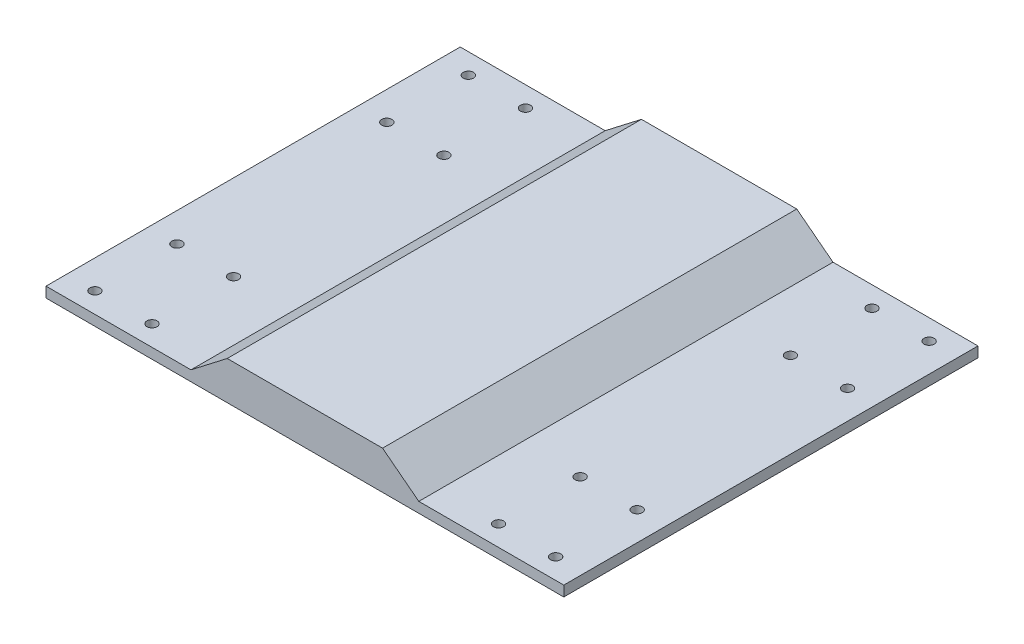
ISO-10303-21;
HEADER;
FILE_DESCRIPTION(('STEP AP214'),'2;1');
FILE_NAME('part.step','',(''),(''),'','','');
FILE_SCHEMA(('AUTOMOTIVE_DESIGN { 1 0 10303 214 1 1 1 1 }'));
ENDSEC;
DATA;
#1=APPLICATION_CONTEXT('core data for automotive mechanical design processes');
#2=APPLICATION_PROTOCOL_DEFINITION('international standard','automotive_design',2000,#1);
#3=PRODUCT_CONTEXT('',#1,'mechanical');
#4=PRODUCT('Part','Part','',(#3));
#5=PRODUCT_RELATED_PRODUCT_CATEGORY('part','',(#4));
#6=PRODUCT_DEFINITION_FORMATION('','',#4);
#7=PRODUCT_DEFINITION_CONTEXT('part definition',#1,'design');
#8=PRODUCT_DEFINITION('design','',#6,#7);
#9=PRODUCT_DEFINITION_SHAPE('','',#8);
#10=(LENGTH_UNIT() NAMED_UNIT(*) SI_UNIT(.MILLI.,.METRE.));
#11=(NAMED_UNIT(*) PLANE_ANGLE_UNIT() SI_UNIT($,.RADIAN.));
#12=(NAMED_UNIT(*) SI_UNIT($,.STERADIAN.) SOLID_ANGLE_UNIT());
#13=UNCERTAINTY_MEASURE_WITH_UNIT(LENGTH_MEASURE(1.E-05),#10,'distance_accuracy_value','');
#14=(GEOMETRIC_REPRESENTATION_CONTEXT(3) GLOBAL_UNCERTAINTY_ASSIGNED_CONTEXT((#13)) GLOBAL_UNIT_ASSIGNED_CONTEXT((#10,
#11,#12)) REPRESENTATION_CONTEXT('',''));
#15=CARTESIAN_POINT('',(0.,0.,0.));
#16=DIRECTION('',(0.,0.,1.));
#17=DIRECTION('',(1.,0.,0.));
#18=AXIS2_PLACEMENT_3D('',#15,#16,#17);
#19=CARTESIAN_POINT('',(0.,2.54,0.));
#20=DIRECTION('',(0.,1.,0.));
#21=DIRECTION('',(0.,0.,1.));
#22=AXIS2_PLACEMENT_3D('',#19,#20,#21);
#23=PLANE('',#22);
#24=CARTESIAN_POINT('',(21.,2.54,96.6));
#25=DIRECTION('',(0.,-1.,0.));
#26=DIRECTION('',(0.,0.,-1.));
#27=AXIS2_PLACEMENT_3D('',#24,#25,#26);
#28=CIRCLE('',#27,1.25);
#29=CARTESIAN_POINT('',(21.,2.54,95.35));
#30=VERTEX_POINT('',#29);
#31=EDGE_CURVE('E431',#30,#30,#28,.T.);
#32=ORIENTED_EDGE('',*,*,#31,.T.);
#33=EDGE_LOOP('',(#32));
#34=FACE_BOUND('',#33,.T.);
#35=CARTESIAN_POINT('',(21.,2.54,76.6));
#36=DIRECTION('',(0.,-1.,0.));
#37=DIRECTION('',(0.,0.,-1.));
#38=AXIS2_PLACEMENT_3D('',#35,#36,#37);
#39=CIRCLE('',#38,1.25);
#40=CARTESIAN_POINT('',(21.,2.54,75.35));
#41=VERTEX_POINT('',#40);
#42=EDGE_CURVE('E425',#41,#41,#39,.T.);
#43=ORIENTED_EDGE('',*,*,#42,.T.);
#44=EDGE_LOOP('',(#43));
#45=FACE_BOUND('',#44,.T.);
#46=CARTESIAN_POINT('',(7.112,2.54,76.6));
#47=DIRECTION('',(0.,-1.,0.));
#48=DIRECTION('',(0.,0.,-1.));
#49=AXIS2_PLACEMENT_3D('',#46,#47,#48);
#50=CIRCLE('',#49,1.25);
#51=CARTESIAN_POINT('',(7.112,2.54,75.35));
#52=VERTEX_POINT('',#51);
#53=EDGE_CURVE('E419',#52,#52,#50,.T.);
#54=ORIENTED_EDGE('',*,*,#53,.T.);
#55=EDGE_LOOP('',(#54));
#56=FACE_BOUND('',#55,.T.);
#57=CARTESIAN_POINT('',(6.99999999999999,2.54,96.6));
#58=DIRECTION('',(0.,-1.,0.));
#59=DIRECTION('',(0.,0.,-1.));
#60=AXIS2_PLACEMENT_3D('',#57,#58,#59);
#61=CIRCLE('',#60,1.25);
#62=CARTESIAN_POINT('',(6.99999999999999,2.54,95.35));
#63=VERTEX_POINT('',#62);
#64=EDGE_CURVE('E413',#63,#63,#61,.T.);
#65=ORIENTED_EDGE('',*,*,#64,.T.);
#66=EDGE_LOOP('',(#65));
#67=FACE_BOUND('',#66,.T.);
#68=CARTESIAN_POINT('',(21.,2.54,25.));
#69=DIRECTION('',(0.,-1.,0.));
#70=DIRECTION('',(0.,0.,-1.));
#71=AXIS2_PLACEMENT_3D('',#68,#69,#70);
#72=CIRCLE('',#71,1.25);
#73=CARTESIAN_POINT('',(21.,2.54,23.75));
#74=VERTEX_POINT('',#73);
#75=EDGE_CURVE('E407',#74,#74,#72,.T.);
#76=ORIENTED_EDGE('',*,*,#75,.T.);
#77=EDGE_LOOP('',(#76));
#78=FACE_BOUND('',#77,.T.);
#79=CARTESIAN_POINT('',(21.,2.54,5.));
#80=DIRECTION('',(0.,-1.,0.));
#81=DIRECTION('',(0.,0.,-1.));
#82=AXIS2_PLACEMENT_3D('',#79,#80,#81);
#83=CIRCLE('',#82,1.25);
#84=CARTESIAN_POINT('',(21.,2.54,3.75000000000001));
#85=VERTEX_POINT('',#84);
#86=EDGE_CURVE('E401',#85,#85,#83,.T.);
#87=ORIENTED_EDGE('',*,*,#86,.T.);
#88=EDGE_LOOP('',(#87));
#89=FACE_BOUND('',#88,.T.);
#90=CARTESIAN_POINT('',(7.,2.54,5.));
#91=DIRECTION('',(0.,-1.,0.));
#92=DIRECTION('',(0.,0.,-1.));
#93=AXIS2_PLACEMENT_3D('',#90,#91,#92);
#94=CIRCLE('',#93,1.25);
#95=CARTESIAN_POINT('',(7.,2.54,3.75));
#96=VERTEX_POINT('',#95);
#97=EDGE_CURVE('E395',#96,#96,#94,.T.);
#98=ORIENTED_EDGE('',*,*,#97,.T.);
#99=EDGE_LOOP('',(#98));
#100=FACE_BOUND('',#99,.T.);
#101=CARTESIAN_POINT('',(7.,2.54,25.));
#102=DIRECTION('',(0.,-1.,0.));
#103=DIRECTION('',(0.,0.,-1.));
#104=AXIS2_PLACEMENT_3D('',#101,#102,#103);
#105=CIRCLE('',#104,1.25);
#106=CARTESIAN_POINT('',(7.,2.54,23.75));
#107=VERTEX_POINT('',#106);
#108=EDGE_CURVE('E387',#107,#107,#105,.T.);
#109=ORIENTED_EDGE('',*,*,#108,.T.);
#110=EDGE_LOOP('',(#109));
#111=FACE_BOUND('',#110,.T.);
#112=DIRECTION('',(1.,0.,0.));
#113=VECTOR('',#112,1.);
#114=CARTESIAN_POINT('',(0.,2.54,101.6));
#115=LINE('',#114,#113);
#116=CARTESIAN_POINT('',(0.,2.54,101.6));
#117=VERTEX_POINT('',#116);
#118=CARTESIAN_POINT('',(35.56,2.54,101.6));
#119=VERTEX_POINT('',#118);
#120=EDGE_CURVE('E110',#117,#119,#115,.T.);
#121=ORIENTED_EDGE('',*,*,#120,.T.);
#122=DIRECTION('',(0.,0.,1.));
#123=VECTOR('',#122,1.);
#124=CARTESIAN_POINT('',(35.56,2.54,0.));
#125=LINE('',#124,#123);
#126=CARTESIAN_POINT('',(35.56,2.54,0.));
#127=VERTEX_POINT('',#126);
#128=EDGE_CURVE('E223',#127,#119,#125,.T.);
#129=ORIENTED_EDGE('',*,*,#128,.F.);
#130=DIRECTION('',(-1.,0.,0.));
#131=VECTOR('',#130,1.);
#132=CARTESIAN_POINT('',(0.,2.54,0.));
#133=LINE('',#132,#131);
#134=CARTESIAN_POINT('',(0.,2.54,0.));
#135=VERTEX_POINT('',#134);
#136=EDGE_CURVE('E81',#127,#135,#133,.T.);
#137=ORIENTED_EDGE('',*,*,#136,.T.);
#138=DIRECTION('',(0.,0.,1.));
#139=VECTOR('',#138,1.);
#140=CARTESIAN_POINT('',(0.,2.54,0.));
#141=LINE('',#140,#139);
#142=EDGE_CURVE('E359',#135,#117,#141,.T.);
#143=ORIENTED_EDGE('',*,*,#142,.T.);
#144=EDGE_LOOP('',(#121,#129,#137,#143));
#145=FACE_BOUND('',#144,.T.);
#146=ADVANCED_FACE('F55',(#34,#45,#56,#67,#78,#89,#100,#111,#145),#23,.T.);
#147=CARTESIAN_POINT('',(106.,2.54,76.6));
#148=DIRECTION('',(0.,-1.,0.));
#149=DIRECTION('',(0.,0.,-1.));
#150=AXIS2_PLACEMENT_3D('',#147,#148,#149);
#151=CIRCLE('',#150,1.25);
#152=CARTESIAN_POINT('',(106.,2.54,75.35));
#153=VERTEX_POINT('',#152);
#154=EDGE_CURVE('E381',#153,#153,#151,.T.);
#155=ORIENTED_EDGE('',*,*,#154,.T.);
#156=EDGE_LOOP('',(#155));
#157=FACE_BOUND('',#156,.T.);
#158=CARTESIAN_POINT('',(106.,2.54,96.6));
#159=DIRECTION('',(0.,-1.,0.));
#160=DIRECTION('',(0.,0.,-1.));
#161=AXIS2_PLACEMENT_3D('',#158,#159,#160);
#162=CIRCLE('',#161,1.25);
#163=CARTESIAN_POINT('',(106.,2.54,95.35));
#164=VERTEX_POINT('',#163);
#165=EDGE_CURVE('E437',#164,#164,#162,.T.);
#166=ORIENTED_EDGE('',*,*,#165,.T.);
#167=EDGE_LOOP('',(#166));
#168=FACE_BOUND('',#167,.T.);
#169=CARTESIAN_POINT('',(120.,2.54,96.6));
#170=DIRECTION('',(0.,-1.,0.));
#171=DIRECTION('',(0.,0.,-1.));
#172=AXIS2_PLACEMENT_3D('',#169,#170,#171);
#173=CIRCLE('',#172,1.25);
#174=CARTESIAN_POINT('',(120.,2.54,95.35));
#175=VERTEX_POINT('',#174);
#176=EDGE_CURVE('E443',#175,#175,#173,.T.);
#177=ORIENTED_EDGE('',*,*,#176,.T.);
#178=EDGE_LOOP('',(#177));
#179=FACE_BOUND('',#178,.T.);
#180=CARTESIAN_POINT('',(120.,2.54,76.6));
#181=DIRECTION('',(0.,-1.,0.));
#182=DIRECTION('',(0.,0.,-1.));
#183=AXIS2_PLACEMENT_3D('',#180,#181,#182);
#184=CIRCLE('',#183,1.25);
#185=CARTESIAN_POINT('',(120.,2.54,75.35));
#186=VERTEX_POINT('',#185);
#187=EDGE_CURVE('E449',#186,#186,#184,.T.);
#188=ORIENTED_EDGE('',*,*,#187,.T.);
#189=EDGE_LOOP('',(#188));
#190=FACE_BOUND('',#189,.T.);
#191=CARTESIAN_POINT('',(106.,2.54,25.));
#192=DIRECTION('',(0.,-1.,0.));
#193=DIRECTION('',(0.,0.,-1.));
#194=AXIS2_PLACEMENT_3D('',#191,#192,#193);
#195=CIRCLE('',#194,1.25);
#196=CARTESIAN_POINT('',(106.,2.54,23.75));
#197=VERTEX_POINT('',#196);
#198=EDGE_CURVE('E455',#197,#197,#195,.T.);
#199=ORIENTED_EDGE('',*,*,#198,.T.);
#200=EDGE_LOOP('',(#199));
#201=FACE_BOUND('',#200,.T.);
#202=CARTESIAN_POINT('',(106.,2.54,5.00000000000005));
#203=DIRECTION('',(0.,-1.,0.));
#204=DIRECTION('',(0.,0.,-1.));
#205=AXIS2_PLACEMENT_3D('',#202,#203,#204);
#206=CIRCLE('',#205,1.25);
#207=CARTESIAN_POINT('',(106.,2.54,3.75000000000004));
#208=VERTEX_POINT('',#207);
#209=EDGE_CURVE('E461',#208,#208,#206,.T.);
#210=ORIENTED_EDGE('',*,*,#209,.T.);
#211=EDGE_LOOP('',(#210));
#212=FACE_BOUND('',#211,.T.);
#213=CARTESIAN_POINT('',(120.,2.54,25.));
#214=DIRECTION('',(0.,-1.,0.));
#215=DIRECTION('',(0.,0.,-1.));
#216=AXIS2_PLACEMENT_3D('',#213,#214,#215);
#217=CIRCLE('',#216,1.25);
#218=CARTESIAN_POINT('',(120.,2.54,23.75));
#219=VERTEX_POINT('',#218);
#220=EDGE_CURVE('E467',#219,#219,#217,.T.);
#221=ORIENTED_EDGE('',*,*,#220,.T.);
#222=EDGE_LOOP('',(#221));
#223=FACE_BOUND('',#222,.T.);
#224=CARTESIAN_POINT('',(120.,2.54,5.00000000000005));
#225=DIRECTION('',(0.,-1.,0.));
#226=DIRECTION('',(0.,0.,-1.));
#227=AXIS2_PLACEMENT_3D('',#224,#225,#226);
#228=CIRCLE('',#227,1.25);
#229=CARTESIAN_POINT('',(120.,2.54,3.75000000000005));
#230=VERTEX_POINT('',#229);
#231=EDGE_CURVE('E472',#230,#230,#228,.T.);
#232=ORIENTED_EDGE('',*,*,#231,.T.);
#233=EDGE_LOOP('',(#232));
#234=FACE_BOUND('',#233,.T.);
#235=CARTESIAN_POINT('',(127.,2.54,0.));
#236=VERTEX_POINT('',#235);
#237=CARTESIAN_POINT('',(91.44,2.54,0.));
#238=VERTEX_POINT('',#237);
#239=EDGE_CURVE('E365',#236,#238,#133,.T.);
#240=ORIENTED_EDGE('',*,*,#239,.T.);
#241=DIRECTION('',(0.,0.,-1.));
#242=VECTOR('',#241,1.);
#243=CARTESIAN_POINT('',(91.44,2.54,0.));
#244=LINE('',#243,#242);
#245=CARTESIAN_POINT('',(91.44,2.54,101.6));
#246=VERTEX_POINT('',#245);
#247=EDGE_CURVE('E138',#246,#238,#244,.T.);
#248=ORIENTED_EDGE('',*,*,#247,.F.);
#249=CARTESIAN_POINT('',(127.,2.54,101.6));
#250=VERTEX_POINT('',#249);
#251=EDGE_CURVE('E369',#246,#250,#115,.T.);
#252=ORIENTED_EDGE('',*,*,#251,.T.);
#253=DIRECTION('',(0.,0.,-1.));
#254=VECTOR('',#253,1.);
#255=CARTESIAN_POINT('',(127.,2.54,0.));
#256=LINE('',#255,#254);
#257=EDGE_CURVE('E355',#250,#236,#256,.T.);
#258=ORIENTED_EDGE('',*,*,#257,.T.);
#259=EDGE_LOOP('',(#240,#248,#252,#258));
#260=FACE_BOUND('',#259,.T.);
#261=ADVANCED_FACE('F304',(#157,#168,#179,#190,#201,#212,#223,#234,#260),#23,.T.);
#262=CARTESIAN_POINT('',(0.,2.54,0.));
#263=DIRECTION('',(1.,0.,0.));
#264=DIRECTION('',(0.,0.,-1.));
#265=AXIS2_PLACEMENT_3D('',#262,#263,#264);
#266=PLANE('',#265);
#267=DIRECTION('',(0.,0.,1.));
#268=VECTOR('',#267,1.);
#269=CARTESIAN_POINT('',(0.,0.,0.));
#270=LINE('',#269,#268);
#271=CARTESIAN_POINT('',(0.,0.,0.));
#272=VERTEX_POINT('',#271);
#273=CARTESIAN_POINT('',(0.,0.,101.6));
#274=VERTEX_POINT('',#273);
#275=EDGE_CURVE('E352',#272,#274,#270,.T.);
#276=ORIENTED_EDGE('',*,*,#275,.T.);
#277=DIRECTION('',(0.,-1.,0.));
#278=VECTOR('',#277,1.);
#279=CARTESIAN_POINT('',(0.,2.54,101.6));
#280=LINE('',#279,#278);
#281=EDGE_CURVE('E12',#117,#274,#280,.T.);
#282=ORIENTED_EDGE('',*,*,#281,.F.);
#283=ORIENTED_EDGE('',*,*,#142,.F.);
#284=DIRECTION('',(0.,-1.,0.));
#285=VECTOR('',#284,1.);
#286=CARTESIAN_POINT('',(0.,2.54,0.));
#287=LINE('',#286,#285);
#288=EDGE_CURVE('E363',#135,#272,#287,.T.);
#289=ORIENTED_EDGE('',*,*,#288,.T.);
#290=EDGE_LOOP('',(#276,#282,#283,#289));
#291=FACE_BOUND('',#290,.T.);
#292=ADVANCED_FACE('F57',(#291),#266,.F.);
#293=CARTESIAN_POINT('',(0.,2.54,101.6));
#294=DIRECTION('',(0.,0.,-1.));
#295=DIRECTION('',(-1.,0.,0.));
#296=AXIS2_PLACEMENT_3D('',#293,#294,#295);
#297=PLANE('',#296);
#298=DIRECTION('',(1.,0.,0.));
#299=VECTOR('',#298,1.);
#300=CARTESIAN_POINT('',(0.,0.,101.6));
#301=LINE('',#300,#299);
#302=CARTESIAN_POINT('',(127.,0.,101.6));
#303=VERTEX_POINT('',#302);
#304=EDGE_CURVE('E342',#274,#303,#301,.T.);
#305=ORIENTED_EDGE('',*,*,#304,.T.);
#306=DIRECTION('',(0.,-1.,0.));
#307=VECTOR('',#306,1.);
#308=CARTESIAN_POINT('',(127.,2.54,101.6));
#309=LINE('',#308,#307);
#310=EDGE_CURVE('E64',#250,#303,#309,.T.);
#311=ORIENTED_EDGE('',*,*,#310,.F.);
#312=ORIENTED_EDGE('',*,*,#251,.F.);
#313=DIRECTION('',(0.791782255563472,-0.610803454291821,0.));
#314=VECTOR('',#313,1.);
#315=CARTESIAN_POINT('',(82.55,9.398,101.6));
#316=LINE('',#315,#314);
#317=CARTESIAN_POINT('',(82.55,9.398,101.6));
#318=VERTEX_POINT('',#317);
#319=EDGE_CURVE('E72',#318,#246,#316,.T.);
#320=ORIENTED_EDGE('',*,*,#319,.F.);
#321=DIRECTION('',(1.,0.,0.));
#322=VECTOR('',#321,1.);
#323=CARTESIAN_POINT('',(82.55,9.398,101.6));
#324=LINE('',#323,#322);
#325=CARTESIAN_POINT('',(44.45,9.398,101.6));
#326=VERTEX_POINT('',#325);
#327=EDGE_CURVE('E157',#326,#318,#324,.T.);
#328=ORIENTED_EDGE('',*,*,#327,.F.);
#329=DIRECTION('',(-0.791782255563471,-0.610803454291822,0.));
#330=VECTOR('',#329,1.);
#331=CARTESIAN_POINT('',(44.45,9.398,101.6));
#332=LINE('',#331,#330);
#333=EDGE_CURVE('E221',#326,#119,#332,.T.);
#334=ORIENTED_EDGE('',*,*,#333,.T.);
#335=ORIENTED_EDGE('',*,*,#120,.F.);
#336=ORIENTED_EDGE('',*,*,#281,.T.);
#337=EDGE_LOOP('',(#305,#311,#312,#320,#328,#334,#335,#336));
#338=FACE_BOUND('',#337,.T.);
#339=ADVANCED_FACE('F326',(#338),#297,.F.);
#340=CARTESIAN_POINT('',(127.,2.54,0.));
#341=DIRECTION('',(-1.,0.,0.));
#342=DIRECTION('',(0.,0.,1.));
#343=AXIS2_PLACEMENT_3D('',#340,#341,#342);
#344=PLANE('',#343);
#345=DIRECTION('',(0.,0.,-1.));
#346=VECTOR('',#345,1.);
#347=CARTESIAN_POINT('',(127.,0.,0.));
#348=LINE('',#347,#346);
#349=CARTESIAN_POINT('',(127.,0.,0.));
#350=VERTEX_POINT('',#349);
#351=EDGE_CURVE('E351',#303,#350,#348,.T.);
#352=ORIENTED_EDGE('',*,*,#351,.T.);
#353=DIRECTION('',(0.,-1.,0.));
#354=VECTOR('',#353,1.);
#355=CARTESIAN_POINT('',(127.,2.54,0.));
#356=LINE('',#355,#354);
#357=EDGE_CURVE('E356',#236,#350,#356,.T.);
#358=ORIENTED_EDGE('',*,*,#357,.F.);
#359=ORIENTED_EDGE('',*,*,#257,.F.);
#360=ORIENTED_EDGE('',*,*,#310,.T.);
#361=EDGE_LOOP('',(#352,#358,#359,#360));
#362=FACE_BOUND('',#361,.T.);
#363=ADVANCED_FACE('F312',(#362),#344,.F.);
#364=CARTESIAN_POINT('',(0.,2.54,0.));
#365=DIRECTION('',(0.,0.,1.));
#366=DIRECTION('',(1.,0.,0.));
#367=AXIS2_PLACEMENT_3D('',#364,#365,#366);
#368=PLANE('',#367);
#369=DIRECTION('',(-1.,0.,0.));
#370=VECTOR('',#369,1.);
#371=CARTESIAN_POINT('',(0.,0.,0.));
#372=LINE('',#371,#370);
#373=EDGE_CURVE('E103',#350,#272,#372,.T.);
#374=ORIENTED_EDGE('',*,*,#373,.T.);
#375=ORIENTED_EDGE('',*,*,#288,.F.);
#376=ORIENTED_EDGE('',*,*,#136,.F.);
#377=DIRECTION('',(-0.791782255563471,-0.610803454291822,0.));
#378=VECTOR('',#377,1.);
#379=CARTESIAN_POINT('',(44.45,9.398,0.));
#380=LINE('',#379,#378);
#381=CARTESIAN_POINT('',(44.45,9.398,0.));
#382=VERTEX_POINT('',#381);
#383=EDGE_CURVE('E141',#382,#127,#380,.T.);
#384=ORIENTED_EDGE('',*,*,#383,.F.);
#385=DIRECTION('',(-1.,0.,0.));
#386=VECTOR('',#385,1.);
#387=CARTESIAN_POINT('',(82.55,9.398,0.));
#388=LINE('',#387,#386);
#389=CARTESIAN_POINT('',(82.55,9.398,0.));
#390=VERTEX_POINT('',#389);
#391=EDGE_CURVE('E142',#390,#382,#388,.T.);
#392=ORIENTED_EDGE('',*,*,#391,.F.);
#393=DIRECTION('',(0.791782255563473,-0.61080345429182,0.));
#394=VECTOR('',#393,1.);
#395=CARTESIAN_POINT('',(82.55,9.398,0.));
#396=LINE('',#395,#394);
#397=EDGE_CURVE('E132',#390,#238,#396,.T.);
#398=ORIENTED_EDGE('',*,*,#397,.T.);
#399=ORIENTED_EDGE('',*,*,#239,.F.);
#400=ORIENTED_EDGE('',*,*,#357,.T.);
#401=EDGE_LOOP('',(#374,#375,#376,#384,#392,#398,#399,#400));
#402=FACE_BOUND('',#401,.T.);
#403=ADVANCED_FACE('F146',(#402),#368,.F.);
#404=CARTESIAN_POINT('',(0.,0.,0.));
#405=DIRECTION('',(0.,1.,0.));
#406=DIRECTION('',(0.,0.,1.));
#407=AXIS2_PLACEMENT_3D('',#404,#405,#406);
#408=PLANE('',#407);
#409=CARTESIAN_POINT('',(120.,0.,5.00000000000005));
#410=DIRECTION('',(0.,-1.,0.));
#411=DIRECTION('',(0.,0.,-1.));
#412=AXIS2_PLACEMENT_3D('',#409,#410,#411);
#413=CIRCLE('',#412,1.25);
#414=CARTESIAN_POINT('',(120.,0.,3.75000000000005));
#415=VERTEX_POINT('',#414);
#416=EDGE_CURVE('E168',#415,#415,#413,.T.);
#417=ORIENTED_EDGE('',*,*,#416,.F.);
#418=EDGE_LOOP('',(#417));
#419=FACE_BOUND('',#418,.T.);
#420=CARTESIAN_POINT('',(120.,0.,25.));
#421=DIRECTION('',(0.,-1.,0.));
#422=DIRECTION('',(0.,0.,-1.));
#423=AXIS2_PLACEMENT_3D('',#420,#421,#422);
#424=CIRCLE('',#423,1.25);
#425=CARTESIAN_POINT('',(120.,0.,23.75));
#426=VERTEX_POINT('',#425);
#427=EDGE_CURVE('E470',#426,#426,#424,.T.);
#428=ORIENTED_EDGE('',*,*,#427,.F.);
#429=EDGE_LOOP('',(#428));
#430=FACE_BOUND('',#429,.T.);
#431=CARTESIAN_POINT('',(106.,0.,5.00000000000005));
#432=DIRECTION('',(0.,-1.,0.));
#433=DIRECTION('',(0.,0.,-1.));
#434=AXIS2_PLACEMENT_3D('',#431,#432,#433);
#435=CIRCLE('',#434,1.25);
#436=CARTESIAN_POINT('',(106.,0.,3.75000000000004));
#437=VERTEX_POINT('',#436);
#438=EDGE_CURVE('E464',#437,#437,#435,.T.);
#439=ORIENTED_EDGE('',*,*,#438,.F.);
#440=EDGE_LOOP('',(#439));
#441=FACE_BOUND('',#440,.T.);
#442=CARTESIAN_POINT('',(106.,0.,25.));
#443=DIRECTION('',(0.,-1.,0.));
#444=DIRECTION('',(0.,0.,-1.));
#445=AXIS2_PLACEMENT_3D('',#442,#443,#444);
#446=CIRCLE('',#445,1.25);
#447=CARTESIAN_POINT('',(106.,0.,23.75));
#448=VERTEX_POINT('',#447);
#449=EDGE_CURVE('E458',#448,#448,#446,.T.);
#450=ORIENTED_EDGE('',*,*,#449,.F.);
#451=EDGE_LOOP('',(#450));
#452=FACE_BOUND('',#451,.T.);
#453=CARTESIAN_POINT('',(120.,0.,76.6));
#454=DIRECTION('',(0.,-1.,0.));
#455=DIRECTION('',(0.,0.,-1.));
#456=AXIS2_PLACEMENT_3D('',#453,#454,#455);
#457=CIRCLE('',#456,1.25);
#458=CARTESIAN_POINT('',(120.,0.,75.35));
#459=VERTEX_POINT('',#458);
#460=EDGE_CURVE('E452',#459,#459,#457,.T.);
#461=ORIENTED_EDGE('',*,*,#460,.F.);
#462=EDGE_LOOP('',(#461));
#463=FACE_BOUND('',#462,.T.);
#464=CARTESIAN_POINT('',(120.,0.,96.6));
#465=DIRECTION('',(0.,-1.,0.));
#466=DIRECTION('',(0.,0.,-1.));
#467=AXIS2_PLACEMENT_3D('',#464,#465,#466);
#468=CIRCLE('',#467,1.25);
#469=CARTESIAN_POINT('',(120.,0.,95.35));
#470=VERTEX_POINT('',#469);
#471=EDGE_CURVE('E446',#470,#470,#468,.T.);
#472=ORIENTED_EDGE('',*,*,#471,.F.);
#473=EDGE_LOOP('',(#472));
#474=FACE_BOUND('',#473,.T.);
#475=CARTESIAN_POINT('',(106.,0.,96.6));
#476=DIRECTION('',(0.,-1.,0.));
#477=DIRECTION('',(0.,0.,-1.));
#478=AXIS2_PLACEMENT_3D('',#475,#476,#477);
#479=CIRCLE('',#478,1.25);
#480=CARTESIAN_POINT('',(106.,0.,95.35));
#481=VERTEX_POINT('',#480);
#482=EDGE_CURVE('E440',#481,#481,#479,.T.);
#483=ORIENTED_EDGE('',*,*,#482,.F.);
#484=EDGE_LOOP('',(#483));
#485=FACE_BOUND('',#484,.T.);
#486=CARTESIAN_POINT('',(21.,0.,96.6));
#487=DIRECTION('',(0.,-1.,0.));
#488=DIRECTION('',(0.,0.,-1.));
#489=AXIS2_PLACEMENT_3D('',#486,#487,#488);
#490=CIRCLE('',#489,1.25);
#491=CARTESIAN_POINT('',(21.,0.,95.35));
#492=VERTEX_POINT('',#491);
#493=EDGE_CURVE('E434',#492,#492,#490,.T.);
#494=ORIENTED_EDGE('',*,*,#493,.F.);
#495=EDGE_LOOP('',(#494));
#496=FACE_BOUND('',#495,.T.);
#497=CARTESIAN_POINT('',(21.,0.,76.6));
#498=DIRECTION('',(0.,-1.,0.));
#499=DIRECTION('',(0.,0.,-1.));
#500=AXIS2_PLACEMENT_3D('',#497,#498,#499);
#501=CIRCLE('',#500,1.25);
#502=CARTESIAN_POINT('',(21.,0.,75.35));
#503=VERTEX_POINT('',#502);
#504=EDGE_CURVE('E428',#503,#503,#501,.T.);
#505=ORIENTED_EDGE('',*,*,#504,.F.);
#506=EDGE_LOOP('',(#505));
#507=FACE_BOUND('',#506,.T.);
#508=CARTESIAN_POINT('',(7.112,0.,76.6));
#509=DIRECTION('',(0.,-1.,0.));
#510=DIRECTION('',(0.,0.,-1.));
#511=AXIS2_PLACEMENT_3D('',#508,#509,#510);
#512=CIRCLE('',#511,1.25);
#513=CARTESIAN_POINT('',(7.112,0.,75.35));
#514=VERTEX_POINT('',#513);
#515=EDGE_CURVE('E422',#514,#514,#512,.T.);
#516=ORIENTED_EDGE('',*,*,#515,.F.);
#517=EDGE_LOOP('',(#516));
#518=FACE_BOUND('',#517,.T.);
#519=CARTESIAN_POINT('',(6.99999999999999,0.,96.6));
#520=DIRECTION('',(0.,-1.,0.));
#521=DIRECTION('',(0.,0.,-1.));
#522=AXIS2_PLACEMENT_3D('',#519,#520,#521);
#523=CIRCLE('',#522,1.25);
#524=CARTESIAN_POINT('',(6.99999999999999,0.,95.35));
#525=VERTEX_POINT('',#524);
#526=EDGE_CURVE('E416',#525,#525,#523,.T.);
#527=ORIENTED_EDGE('',*,*,#526,.F.);
#528=EDGE_LOOP('',(#527));
#529=FACE_BOUND('',#528,.T.);
#530=CARTESIAN_POINT('',(21.,0.,25.));
#531=DIRECTION('',(0.,-1.,0.));
#532=DIRECTION('',(0.,0.,-1.));
#533=AXIS2_PLACEMENT_3D('',#530,#531,#532);
#534=CIRCLE('',#533,1.25);
#535=CARTESIAN_POINT('',(21.,0.,23.75));
#536=VERTEX_POINT('',#535);
#537=EDGE_CURVE('E410',#536,#536,#534,.T.);
#538=ORIENTED_EDGE('',*,*,#537,.F.);
#539=EDGE_LOOP('',(#538));
#540=FACE_BOUND('',#539,.T.);
#541=CARTESIAN_POINT('',(21.,0.,5.));
#542=DIRECTION('',(0.,-1.,0.));
#543=DIRECTION('',(0.,0.,-1.));
#544=AXIS2_PLACEMENT_3D('',#541,#542,#543);
#545=CIRCLE('',#544,1.25);
#546=CARTESIAN_POINT('',(21.,0.,3.75));
#547=VERTEX_POINT('',#546);
#548=EDGE_CURVE('E404',#547,#547,#545,.T.);
#549=ORIENTED_EDGE('',*,*,#548,.F.);
#550=EDGE_LOOP('',(#549));
#551=FACE_BOUND('',#550,.T.);
#552=CARTESIAN_POINT('',(7.,0.,5.));
#553=DIRECTION('',(0.,-1.,0.));
#554=DIRECTION('',(0.,0.,-1.));
#555=AXIS2_PLACEMENT_3D('',#552,#553,#554);
#556=CIRCLE('',#555,1.25);
#557=CARTESIAN_POINT('',(7.,0.,3.75));
#558=VERTEX_POINT('',#557);
#559=EDGE_CURVE('E398',#558,#558,#556,.T.);
#560=ORIENTED_EDGE('',*,*,#559,.F.);
#561=EDGE_LOOP('',(#560));
#562=FACE_BOUND('',#561,.T.);
#563=CARTESIAN_POINT('',(7.,0.,25.));
#564=DIRECTION('',(0.,-1.,0.));
#565=DIRECTION('',(0.,0.,-1.));
#566=AXIS2_PLACEMENT_3D('',#563,#564,#565);
#567=CIRCLE('',#566,1.25);
#568=CARTESIAN_POINT('',(7.,0.,23.75));
#569=VERTEX_POINT('',#568);
#570=EDGE_CURVE('E392',#569,#569,#567,.T.);
#571=ORIENTED_EDGE('',*,*,#570,.F.);
#572=EDGE_LOOP('',(#571));
#573=FACE_BOUND('',#572,.T.);
#574=CARTESIAN_POINT('',(106.,0.,76.6));
#575=DIRECTION('',(0.,-1.,0.));
#576=DIRECTION('',(0.,0.,-1.));
#577=AXIS2_PLACEMENT_3D('',#574,#575,#576);
#578=CIRCLE('',#577,1.25);
#579=CARTESIAN_POINT('',(106.,0.,75.35));
#580=VERTEX_POINT('',#579);
#581=EDGE_CURVE('E383',#580,#580,#578,.T.);
#582=ORIENTED_EDGE('',*,*,#581,.F.);
#583=EDGE_LOOP('',(#582));
#584=FACE_BOUND('',#583,.T.);
#585=ORIENTED_EDGE('',*,*,#275,.F.);
#586=ORIENTED_EDGE('',*,*,#373,.F.);
#587=ORIENTED_EDGE('',*,*,#351,.F.);
#588=ORIENTED_EDGE('',*,*,#304,.F.);
#589=EDGE_LOOP('',(#585,#586,#587,#588));
#590=FACE_BOUND('',#589,.T.);
#591=ADVANCED_FACE('F300',(#419,#430,#441,#452,#463,#474,#485,#496,#507,#518,#529,#540,#551,
#562,#573,#584,#590),#408,.F.);
#592=CARTESIAN_POINT('',(106.,0.,76.6));
#593=DIRECTION('',(0.,-1.,0.));
#594=DIRECTION('',(0.,0.,-1.));
#595=AXIS2_PLACEMENT_3D('',#592,#593,#594);
#596=CYLINDRICAL_SURFACE('',#595,1.25);
#597=ORIENTED_EDGE('',*,*,#154,.F.);
#598=EDGE_LOOP('',(#597));
#599=FACE_BOUND('',#598,.T.);
#600=ORIENTED_EDGE('',*,*,#581,.T.);
#601=EDGE_LOOP('',(#600));
#602=FACE_BOUND('',#601,.T.);
#603=ADVANCED_FACE('F296',(#599,#602),#596,.F.);
#604=CARTESIAN_POINT('',(7.,0.,25.));
#605=DIRECTION('',(0.,-1.,0.));
#606=DIRECTION('',(0.,0.,-1.));
#607=AXIS2_PLACEMENT_3D('',#604,#605,#606);
#608=CYLINDRICAL_SURFACE('',#607,1.25);
#609=ORIENTED_EDGE('',*,*,#108,.F.);
#610=EDGE_LOOP('',(#609));
#611=FACE_BOUND('',#610,.T.);
#612=ORIENTED_EDGE('',*,*,#570,.T.);
#613=EDGE_LOOP('',(#612));
#614=FACE_BOUND('',#613,.T.);
#615=ADVANCED_FACE('F292',(#611,#614),#608,.F.);
#616=CARTESIAN_POINT('',(7.,0.,5.));
#617=DIRECTION('',(0.,-1.,0.));
#618=DIRECTION('',(0.,0.,-1.));
#619=AXIS2_PLACEMENT_3D('',#616,#617,#618);
#620=CYLINDRICAL_SURFACE('',#619,1.25);
#621=ORIENTED_EDGE('',*,*,#97,.F.);
#622=EDGE_LOOP('',(#621));
#623=FACE_BOUND('',#622,.T.);
#624=ORIENTED_EDGE('',*,*,#559,.T.);
#625=EDGE_LOOP('',(#624));
#626=FACE_BOUND('',#625,.T.);
#627=ADVANCED_FACE('F288',(#623,#626),#620,.F.);
#628=CARTESIAN_POINT('',(21.,0.,5.));
#629=DIRECTION('',(0.,-1.,0.));
#630=DIRECTION('',(0.,0.,-1.));
#631=AXIS2_PLACEMENT_3D('',#628,#629,#630);
#632=CYLINDRICAL_SURFACE('',#631,1.25);
#633=ORIENTED_EDGE('',*,*,#86,.F.);
#634=EDGE_LOOP('',(#633));
#635=FACE_BOUND('',#634,.T.);
#636=ORIENTED_EDGE('',*,*,#548,.T.);
#637=EDGE_LOOP('',(#636));
#638=FACE_BOUND('',#637,.T.);
#639=ADVANCED_FACE('F284',(#635,#638),#632,.F.);
#640=CARTESIAN_POINT('',(21.,0.,25.));
#641=DIRECTION('',(0.,-1.,0.));
#642=DIRECTION('',(0.,0.,-1.));
#643=AXIS2_PLACEMENT_3D('',#640,#641,#642);
#644=CYLINDRICAL_SURFACE('',#643,1.25);
#645=ORIENTED_EDGE('',*,*,#75,.F.);
#646=EDGE_LOOP('',(#645));
#647=FACE_BOUND('',#646,.T.);
#648=ORIENTED_EDGE('',*,*,#537,.T.);
#649=EDGE_LOOP('',(#648));
#650=FACE_BOUND('',#649,.T.);
#651=ADVANCED_FACE('F280',(#647,#650),#644,.F.);
#652=CARTESIAN_POINT('',(6.99999999999999,0.,96.6));
#653=DIRECTION('',(0.,-1.,0.));
#654=DIRECTION('',(0.,0.,-1.));
#655=AXIS2_PLACEMENT_3D('',#652,#653,#654);
#656=CYLINDRICAL_SURFACE('',#655,1.25);
#657=ORIENTED_EDGE('',*,*,#64,.F.);
#658=EDGE_LOOP('',(#657));
#659=FACE_BOUND('',#658,.T.);
#660=ORIENTED_EDGE('',*,*,#526,.T.);
#661=EDGE_LOOP('',(#660));
#662=FACE_BOUND('',#661,.T.);
#663=ADVANCED_FACE('F276',(#659,#662),#656,.F.);
#664=CARTESIAN_POINT('',(7.112,0.,76.6));
#665=DIRECTION('',(0.,-1.,0.));
#666=DIRECTION('',(0.,0.,-1.));
#667=AXIS2_PLACEMENT_3D('',#664,#665,#666);
#668=CYLINDRICAL_SURFACE('',#667,1.25);
#669=ORIENTED_EDGE('',*,*,#53,.F.);
#670=EDGE_LOOP('',(#669));
#671=FACE_BOUND('',#670,.T.);
#672=ORIENTED_EDGE('',*,*,#515,.T.);
#673=EDGE_LOOP('',(#672));
#674=FACE_BOUND('',#673,.T.);
#675=ADVANCED_FACE('F272',(#671,#674),#668,.F.);
#676=CARTESIAN_POINT('',(21.,0.,76.6));
#677=DIRECTION('',(0.,-1.,0.));
#678=DIRECTION('',(0.,0.,-1.));
#679=AXIS2_PLACEMENT_3D('',#676,#677,#678);
#680=CYLINDRICAL_SURFACE('',#679,1.25);
#681=ORIENTED_EDGE('',*,*,#42,.F.);
#682=EDGE_LOOP('',(#681));
#683=FACE_BOUND('',#682,.T.);
#684=ORIENTED_EDGE('',*,*,#504,.T.);
#685=EDGE_LOOP('',(#684));
#686=FACE_BOUND('',#685,.T.);
#687=ADVANCED_FACE('F268',(#683,#686),#680,.F.);
#688=CARTESIAN_POINT('',(21.,0.,96.6));
#689=DIRECTION('',(0.,-1.,0.));
#690=DIRECTION('',(0.,0.,-1.));
#691=AXIS2_PLACEMENT_3D('',#688,#689,#690);
#692=CYLINDRICAL_SURFACE('',#691,1.25);
#693=ORIENTED_EDGE('',*,*,#31,.F.);
#694=EDGE_LOOP('',(#693));
#695=FACE_BOUND('',#694,.T.);
#696=ORIENTED_EDGE('',*,*,#493,.T.);
#697=EDGE_LOOP('',(#696));
#698=FACE_BOUND('',#697,.T.);
#699=ADVANCED_FACE('F264',(#695,#698),#692,.F.);
#700=CARTESIAN_POINT('',(106.,0.,96.6));
#701=DIRECTION('',(0.,-1.,0.));
#702=DIRECTION('',(0.,0.,-1.));
#703=AXIS2_PLACEMENT_3D('',#700,#701,#702);
#704=CYLINDRICAL_SURFACE('',#703,1.25);
#705=ORIENTED_EDGE('',*,*,#165,.F.);
#706=EDGE_LOOP('',(#705));
#707=FACE_BOUND('',#706,.T.);
#708=ORIENTED_EDGE('',*,*,#482,.T.);
#709=EDGE_LOOP('',(#708));
#710=FACE_BOUND('',#709,.T.);
#711=ADVANCED_FACE('F260',(#707,#710),#704,.F.);
#712=CARTESIAN_POINT('',(120.,0.,96.6));
#713=DIRECTION('',(0.,-1.,0.));
#714=DIRECTION('',(0.,0.,-1.));
#715=AXIS2_PLACEMENT_3D('',#712,#713,#714);
#716=CYLINDRICAL_SURFACE('',#715,1.25);
#717=ORIENTED_EDGE('',*,*,#176,.F.);
#718=EDGE_LOOP('',(#717));
#719=FACE_BOUND('',#718,.T.);
#720=ORIENTED_EDGE('',*,*,#471,.T.);
#721=EDGE_LOOP('',(#720));
#722=FACE_BOUND('',#721,.T.);
#723=ADVANCED_FACE('F256',(#719,#722),#716,.F.);
#724=CARTESIAN_POINT('',(120.,0.,76.6));
#725=DIRECTION('',(0.,-1.,0.));
#726=DIRECTION('',(0.,0.,-1.));
#727=AXIS2_PLACEMENT_3D('',#724,#725,#726);
#728=CYLINDRICAL_SURFACE('',#727,1.25);
#729=ORIENTED_EDGE('',*,*,#187,.F.);
#730=EDGE_LOOP('',(#729));
#731=FACE_BOUND('',#730,.T.);
#732=ORIENTED_EDGE('',*,*,#460,.T.);
#733=EDGE_LOOP('',(#732));
#734=FACE_BOUND('',#733,.T.);
#735=ADVANCED_FACE('F252',(#731,#734),#728,.F.);
#736=CARTESIAN_POINT('',(106.,0.,25.));
#737=DIRECTION('',(0.,-1.,0.));
#738=DIRECTION('',(0.,0.,-1.));
#739=AXIS2_PLACEMENT_3D('',#736,#737,#738);
#740=CYLINDRICAL_SURFACE('',#739,1.25);
#741=ORIENTED_EDGE('',*,*,#198,.F.);
#742=EDGE_LOOP('',(#741));
#743=FACE_BOUND('',#742,.T.);
#744=ORIENTED_EDGE('',*,*,#449,.T.);
#745=EDGE_LOOP('',(#744));
#746=FACE_BOUND('',#745,.T.);
#747=ADVANCED_FACE('F248',(#743,#746),#740,.F.);
#748=CARTESIAN_POINT('',(106.,0.,5.00000000000005));
#749=DIRECTION('',(0.,-1.,0.));
#750=DIRECTION('',(0.,0.,-1.));
#751=AXIS2_PLACEMENT_3D('',#748,#749,#750);
#752=CYLINDRICAL_SURFACE('',#751,1.25);
#753=ORIENTED_EDGE('',*,*,#209,.F.);
#754=EDGE_LOOP('',(#753));
#755=FACE_BOUND('',#754,.T.);
#756=ORIENTED_EDGE('',*,*,#438,.T.);
#757=EDGE_LOOP('',(#756));
#758=FACE_BOUND('',#757,.T.);
#759=ADVANCED_FACE('F244',(#755,#758),#752,.F.);
#760=CARTESIAN_POINT('',(120.,0.,25.));
#761=DIRECTION('',(0.,-1.,0.));
#762=DIRECTION('',(0.,0.,-1.));
#763=AXIS2_PLACEMENT_3D('',#760,#761,#762);
#764=CYLINDRICAL_SURFACE('',#763,1.25);
#765=ORIENTED_EDGE('',*,*,#220,.F.);
#766=EDGE_LOOP('',(#765));
#767=FACE_BOUND('',#766,.T.);
#768=ORIENTED_EDGE('',*,*,#427,.T.);
#769=EDGE_LOOP('',(#768));
#770=FACE_BOUND('',#769,.T.);
#771=ADVANCED_FACE('F240',(#767,#770),#764,.F.);
#772=CARTESIAN_POINT('',(120.,0.,5.00000000000005));
#773=DIRECTION('',(0.,-1.,0.));
#774=DIRECTION('',(0.,0.,-1.));
#775=AXIS2_PLACEMENT_3D('',#772,#773,#774);
#776=CYLINDRICAL_SURFACE('',#775,1.25);
#777=ORIENTED_EDGE('',*,*,#231,.F.);
#778=EDGE_LOOP('',(#777));
#779=FACE_BOUND('',#778,.T.);
#780=ORIENTED_EDGE('',*,*,#416,.T.);
#781=EDGE_LOOP('',(#780));
#782=FACE_BOUND('',#781,.T.);
#783=ADVANCED_FACE('F179',(#779,#782),#776,.F.);
#784=CARTESIAN_POINT('',(0.,9.398,0.));
#785=DIRECTION('',(0.,-1.,0.));
#786=DIRECTION('',(0.,0.,-1.));
#787=AXIS2_PLACEMENT_3D('',#784,#785,#786);
#788=PLANE('',#787);
#789=DIRECTION('',(0.,0.,-1.));
#790=VECTOR('',#789,1.);
#791=CARTESIAN_POINT('',(82.55,9.398,0.));
#792=LINE('',#791,#790);
#793=EDGE_CURVE('E136',#318,#390,#792,.T.);
#794=ORIENTED_EDGE('',*,*,#793,.T.);
#795=ORIENTED_EDGE('',*,*,#391,.T.);
#796=DIRECTION('',(0.,0.,1.));
#797=VECTOR('',#796,1.);
#798=CARTESIAN_POINT('',(44.45,9.398,0.));
#799=LINE('',#798,#797);
#800=EDGE_CURVE('E150',#382,#326,#799,.T.);
#801=ORIENTED_EDGE('',*,*,#800,.T.);
#802=ORIENTED_EDGE('',*,*,#327,.T.);
#803=EDGE_LOOP('',(#794,#795,#801,#802));
#804=FACE_BOUND('',#803,.T.);
#805=ADVANCED_FACE('F155',(#804),#788,.F.);
#806=CARTESIAN_POINT('',(12.03835209826,-15.6052712384852,0.));
#807=DIRECTION('',(-0.610803454291822,0.791782255563471,0.));
#808=DIRECTION('',(-0.791782255563471,-0.610803454291822,0.));
#809=AXIS2_PLACEMENT_3D('',#806,#807,#808);
#810=PLANE('',#809);
#811=ORIENTED_EDGE('',*,*,#383,.T.);
#812=ORIENTED_EDGE('',*,*,#128,.T.);
#813=ORIENTED_EDGE('',*,*,#333,.F.);
#814=ORIENTED_EDGE('',*,*,#800,.F.);
#815=EDGE_LOOP('',(#811,#812,#813,#814));
#816=FACE_BOUND('',#815,.T.);
#817=ADVANCED_FACE('F178',(#816),#810,.T.);
#818=CARTESIAN_POINT('',(35.3429170931423,45.8148925281474,0.));
#819=DIRECTION('',(0.610803454291821,0.791782255563472,0.));
#820=DIRECTION('',(-0.791782255563472,0.610803454291821,0.));
#821=AXIS2_PLACEMENT_3D('',#818,#819,#820);
#822=PLANE('',#821);
#823=ORIENTED_EDGE('',*,*,#319,.T.);
#824=ORIENTED_EDGE('',*,*,#247,.T.);
#825=ORIENTED_EDGE('',*,*,#397,.F.);
#826=ORIENTED_EDGE('',*,*,#793,.F.);
#827=EDGE_LOOP('',(#823,#824,#825,#826));
#828=FACE_BOUND('',#827,.T.);
#829=ADVANCED_FACE('F134',(#828),#822,.T.);
#830=CLOSED_SHELL('',(#146,#261,#292,#339,#363,#403,#591,#603,#615,#627,#639,#651,#663,#675,
#687,#699,#711,#723,#735,#747,#759,#771,#783,#805,#817,#829));
#831=MANIFOLD_SOLID_BREP('B2',#830);
#832=ADVANCED_BREP_SHAPE_REPRESENTATION('',(#18,#831),#14);
#833=SHAPE_DEFINITION_REPRESENTATION(#9,#832);
ENDSEC;
END-ISO-10303-21;
